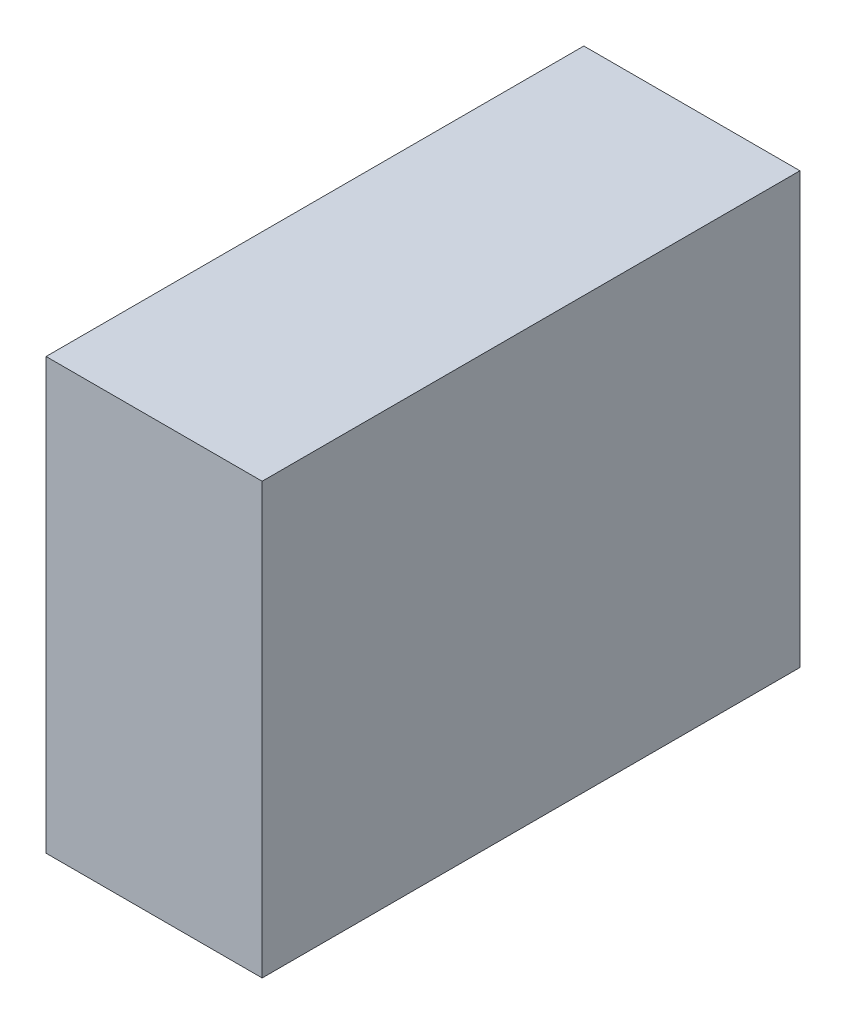
ISO-10303-21;
HEADER;
FILE_DESCRIPTION(('STEP AP214'),'2;1');
FILE_NAME('part.step','',(''),(''),'','','');
FILE_SCHEMA(('AUTOMOTIVE_DESIGN { 1 0 10303 214 1 1 1 1 }'));
ENDSEC;
DATA;
#1=APPLICATION_CONTEXT('core data for automotive mechanical design processes');
#2=APPLICATION_PROTOCOL_DEFINITION('international standard','automotive_design',2000,#1);
#3=PRODUCT_CONTEXT('',#1,'mechanical');
#4=PRODUCT('Part','Part','',(#3));
#5=PRODUCT_RELATED_PRODUCT_CATEGORY('part','',(#4));
#6=PRODUCT_DEFINITION_FORMATION('','',#4);
#7=PRODUCT_DEFINITION_CONTEXT('part definition',#1,'design');
#8=PRODUCT_DEFINITION('design','',#6,#7);
#9=PRODUCT_DEFINITION_SHAPE('','',#8);
#10=(LENGTH_UNIT() NAMED_UNIT(*) SI_UNIT(.MILLI.,.METRE.));
#11=(NAMED_UNIT(*) PLANE_ANGLE_UNIT() SI_UNIT($,.RADIAN.));
#12=(NAMED_UNIT(*) SI_UNIT($,.STERADIAN.) SOLID_ANGLE_UNIT());
#13=UNCERTAINTY_MEASURE_WITH_UNIT(LENGTH_MEASURE(1.E-05),#10,'distance_accuracy_value','');
#14=(GEOMETRIC_REPRESENTATION_CONTEXT(3) GLOBAL_UNCERTAINTY_ASSIGNED_CONTEXT((#13)) GLOBAL_UNIT_ASSIGNED_CONTEXT((#10,
#11,#12)) REPRESENTATION_CONTEXT('',''));
#15=CARTESIAN_POINT('',(0.,0.,0.));
#16=DIRECTION('',(0.,0.,1.));
#17=DIRECTION('',(1.,0.,0.));
#18=AXIS2_PLACEMENT_3D('',#15,#16,#17);
#19=CARTESIAN_POINT('',(-1.97260273972602,8.,-5.));
#20=DIRECTION('',(-1.,0.,0.));
#21=DIRECTION('',(0.,0.,1.));
#22=AXIS2_PLACEMENT_3D('',#19,#20,#21);
#23=PLANE('',#22);
#24=DIRECTION('',(0.,0.,1.));
#25=VECTOR('',#24,1.);
#26=CARTESIAN_POINT('',(-1.97260273972602,0.,-5.));
#27=LINE('',#26,#25);
#28=CARTESIAN_POINT('',(-1.97260273972602,0.,-5.));
#29=VERTEX_POINT('',#28);
#30=CARTESIAN_POINT('',(-1.97260273972602,0.,5.));
#31=VERTEX_POINT('',#30);
#32=EDGE_CURVE('E11',#29,#31,#27,.T.);
#33=ORIENTED_EDGE('',*,*,#32,.T.);
#34=DIRECTION('',(0.,-1.,0.));
#35=VECTOR('',#34,1.);
#36=CARTESIAN_POINT('',(-1.97260273972602,8.,5.));
#37=LINE('',#36,#35);
#38=CARTESIAN_POINT('',(-1.97260273972602,8.,5.));
#39=VERTEX_POINT('',#38);
#40=EDGE_CURVE('E88',#39,#31,#37,.T.);
#41=ORIENTED_EDGE('',*,*,#40,.F.);
#42=DIRECTION('',(0.,0.,1.));
#43=VECTOR('',#42,1.);
#44=CARTESIAN_POINT('',(-1.97260273972602,8.,-5.));
#45=LINE('',#44,#43);
#46=CARTESIAN_POINT('',(-1.97260273972602,8.,-5.));
#47=VERTEX_POINT('',#46);
#48=EDGE_CURVE('E42',#47,#39,#45,.T.);
#49=ORIENTED_EDGE('',*,*,#48,.F.);
#50=DIRECTION('',(0.,-1.,0.));
#51=VECTOR('',#50,1.);
#52=CARTESIAN_POINT('',(-1.97260273972602,8.,-5.));
#53=LINE('',#52,#51);
#54=EDGE_CURVE('E80',#47,#29,#53,.T.);
#55=ORIENTED_EDGE('',*,*,#54,.T.);
#56=EDGE_LOOP('',(#33,#41,#49,#55));
#57=FACE_BOUND('',#56,.T.);
#58=ADVANCED_FACE('F33',(#57),#23,.T.);
#59=CARTESIAN_POINT('',(2.04566210045662,8.,-5.));
#60=DIRECTION('',(0.,1.,0.));
#61=DIRECTION('',(0.,0.,1.));
#62=AXIS2_PLACEMENT_3D('',#59,#60,#61);
#63=PLANE('',#62);
#64=ORIENTED_EDGE('',*,*,#48,.T.);
#65=DIRECTION('',(-1.,0.,0.));
#66=VECTOR('',#65,1.);
#67=CARTESIAN_POINT('',(2.04566210045662,8.,5.));
#68=LINE('',#67,#66);
#69=CARTESIAN_POINT('',(2.04566210045662,8.,5.));
#70=VERTEX_POINT('',#69);
#71=EDGE_CURVE('E91',#70,#39,#68,.T.);
#72=ORIENTED_EDGE('',*,*,#71,.F.);
#73=DIRECTION('',(0.,0.,1.));
#74=VECTOR('',#73,1.);
#75=CARTESIAN_POINT('',(2.04566210045662,8.,-5.));
#76=LINE('',#75,#74);
#77=CARTESIAN_POINT('',(2.04566210045662,8.,-5.));
#78=VERTEX_POINT('',#77);
#79=EDGE_CURVE('E79',#78,#70,#76,.T.);
#80=ORIENTED_EDGE('',*,*,#79,.F.);
#81=DIRECTION('',(-1.,0.,0.));
#82=VECTOR('',#81,1.);
#83=CARTESIAN_POINT('',(2.04566210045662,8.,-5.));
#84=LINE('',#83,#82);
#85=EDGE_CURVE('E99',#78,#47,#84,.T.);
#86=ORIENTED_EDGE('',*,*,#85,.T.);
#87=EDGE_LOOP('',(#64,#72,#80,#86));
#88=FACE_BOUND('',#87,.T.);
#89=ADVANCED_FACE('F103',(#88),#63,.T.);
#90=CARTESIAN_POINT('',(2.04566210045662,0.,-5.));
#91=DIRECTION('',(1.,0.,0.));
#92=DIRECTION('',(0.,0.,-1.));
#93=AXIS2_PLACEMENT_3D('',#90,#91,#92);
#94=PLANE('',#93);
#95=ORIENTED_EDGE('',*,*,#79,.T.);
#96=DIRECTION('',(0.,1.,0.));
#97=VECTOR('',#96,1.);
#98=CARTESIAN_POINT('',(2.04566210045662,0.,5.));
#99=LINE('',#98,#97);
#100=CARTESIAN_POINT('',(2.04566210045662,0.,5.));
#101=VERTEX_POINT('',#100);
#102=EDGE_CURVE('E86',#101,#70,#99,.T.);
#103=ORIENTED_EDGE('',*,*,#102,.F.);
#104=DIRECTION('',(0.,0.,1.));
#105=VECTOR('',#104,1.);
#106=CARTESIAN_POINT('',(2.04566210045662,0.,-5.));
#107=LINE('',#106,#105);
#108=CARTESIAN_POINT('',(2.04566210045662,0.,-5.));
#109=VERTEX_POINT('',#108);
#110=EDGE_CURVE('E37',#109,#101,#107,.T.);
#111=ORIENTED_EDGE('',*,*,#110,.F.);
#112=DIRECTION('',(0.,1.,0.));
#113=VECTOR('',#112,1.);
#114=CARTESIAN_POINT('',(2.04566210045662,0.,-5.));
#115=LINE('',#114,#113);
#116=EDGE_CURVE('E97',#109,#78,#115,.T.);
#117=ORIENTED_EDGE('',*,*,#116,.T.);
#118=EDGE_LOOP('',(#95,#103,#111,#117));
#119=FACE_BOUND('',#118,.T.);
#120=ADVANCED_FACE('F90',(#119),#94,.T.);
#121=CARTESIAN_POINT('',(0.,0.,-5.));
#122=DIRECTION('',(0.,-1.,0.));
#123=DIRECTION('',(0.,0.,-1.));
#124=AXIS2_PLACEMENT_3D('',#121,#122,#123);
#125=PLANE('',#124);
#126=ORIENTED_EDGE('',*,*,#110,.T.);
#127=DIRECTION('',(1.,0.,0.));
#128=VECTOR('',#127,1.);
#129=CARTESIAN_POINT('',(-1.97260273972602,0.,5.));
#130=LINE('',#129,#128);
#131=EDGE_CURVE('E73',#31,#101,#130,.T.);
#132=ORIENTED_EDGE('',*,*,#131,.F.);
#133=ORIENTED_EDGE('',*,*,#32,.F.);
#134=DIRECTION('',(1.,0.,0.));
#135=VECTOR('',#134,1.);
#136=CARTESIAN_POINT('',(-1.97260273972602,0.,-5.));
#137=LINE('',#136,#135);
#138=EDGE_CURVE('E74',#29,#109,#137,.T.);
#139=ORIENTED_EDGE('',*,*,#138,.T.);
#140=EDGE_LOOP('',(#126,#132,#133,#139));
#141=FACE_BOUND('',#140,.T.);
#142=ADVANCED_FACE('F35',(#141),#125,.T.);
#143=CARTESIAN_POINT('',(0.,0.,-5.));
#144=DIRECTION('',(0.,0.,1.));
#145=DIRECTION('',(1.,0.,0.));
#146=AXIS2_PLACEMENT_3D('',#143,#144,#145);
#147=PLANE('',#146);
#148=ORIENTED_EDGE('',*,*,#138,.F.);
#149=ORIENTED_EDGE('',*,*,#54,.F.);
#150=ORIENTED_EDGE('',*,*,#85,.F.);
#151=ORIENTED_EDGE('',*,*,#116,.F.);
#152=EDGE_LOOP('',(#148,#149,#150,#151));
#153=FACE_BOUND('',#152,.T.);
#154=ADVANCED_FACE('F107',(#153),#147,.F.);
#155=CARTESIAN_POINT('',(0.,0.,5.));
#156=DIRECTION('',(0.,0.,1.));
#157=DIRECTION('',(1.,0.,0.));
#158=AXIS2_PLACEMENT_3D('',#155,#156,#157);
#159=PLANE('',#158);
#160=ORIENTED_EDGE('',*,*,#131,.T.);
#161=ORIENTED_EDGE('',*,*,#102,.T.);
#162=ORIENTED_EDGE('',*,*,#71,.T.);
#163=ORIENTED_EDGE('',*,*,#40,.T.);
#164=EDGE_LOOP('',(#160,#161,#162,#163));
#165=FACE_BOUND('',#164,.T.);
#166=ADVANCED_FACE('F84',(#165),#159,.T.);
#167=CLOSED_SHELL('',(#58,#89,#120,#142,#154,#166));
#168=MANIFOLD_SOLID_BREP('B2',#167);
#169=ADVANCED_BREP_SHAPE_REPRESENTATION('',(#18,#168),#14);
#170=SHAPE_DEFINITION_REPRESENTATION(#9,#169);
ENDSEC;
END-ISO-10303-21;
